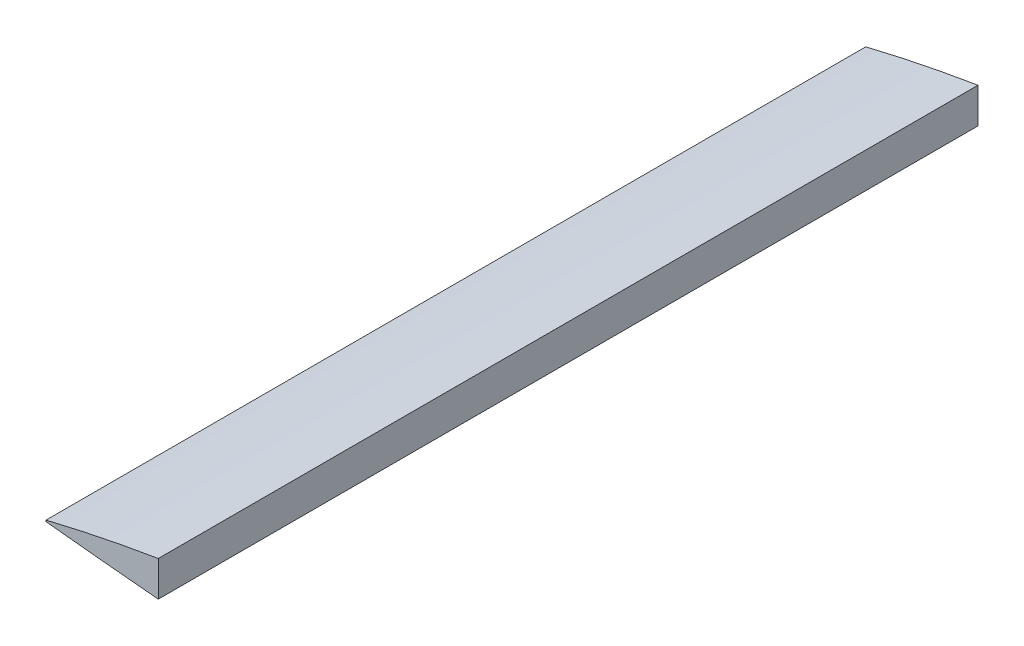
ISO-10303-21;
HEADER;
FILE_DESCRIPTION(('STEP AP214'),'2;1');
FILE_NAME('part.step','',(''),(''),'','','');
FILE_SCHEMA(('AUTOMOTIVE_DESIGN { 1 0 10303 214 1 1 1 1 }'));
ENDSEC;
DATA;
#1=APPLICATION_CONTEXT('core data for automotive mechanical design processes');
#2=APPLICATION_PROTOCOL_DEFINITION('international standard','automotive_design',2000,#1);
#3=PRODUCT_CONTEXT('',#1,'mechanical');
#4=PRODUCT('Part','Part','',(#3));
#5=PRODUCT_RELATED_PRODUCT_CATEGORY('part','',(#4));
#6=PRODUCT_DEFINITION_FORMATION('','',#4);
#7=PRODUCT_DEFINITION_CONTEXT('part definition',#1,'design');
#8=PRODUCT_DEFINITION('design','',#6,#7);
#9=PRODUCT_DEFINITION_SHAPE('','',#8);
#10=(LENGTH_UNIT() NAMED_UNIT(*) SI_UNIT(.MILLI.,.METRE.));
#11=(NAMED_UNIT(*) PLANE_ANGLE_UNIT() SI_UNIT($,.RADIAN.));
#12=(NAMED_UNIT(*) SI_UNIT($,.STERADIAN.) SOLID_ANGLE_UNIT());
#13=UNCERTAINTY_MEASURE_WITH_UNIT(LENGTH_MEASURE(1.E-05),#10,'distance_accuracy_value','');
#14=(GEOMETRIC_REPRESENTATION_CONTEXT(3) GLOBAL_UNCERTAINTY_ASSIGNED_CONTEXT((#13)) GLOBAL_UNIT_ASSIGNED_CONTEXT((#10,
#11,#12)) REPRESENTATION_CONTEXT('',''));
#15=CARTESIAN_POINT('',(0.,0.,0.));
#16=DIRECTION('',(0.,0.,1.));
#17=DIRECTION('',(1.,0.,0.));
#18=AXIS2_PLACEMENT_3D('',#15,#16,#17);
#19=CARTESIAN_POINT('',(-238.52642,17.5878370076643,612.));
#20=CARTESIAN_POINT('',(-240.974092949972,17.1818838754023,612.));
#21=CARTESIAN_POINT('',(-246.929768523728,16.1941190868382,612.));
#22=CARTESIAN_POINT('',(-256.181161895511,14.5460715684089,612.));
#23=CARTESIAN_POINT('',(-266.070660074322,12.7092596735176,612.));
#24=CARTESIAN_POINT('',(-275.306483122763,10.9116484889903,612.));
#25=CARTESIAN_POINT('',(-283.834265101251,9.183942036888,612.));
#26=CARTESIAN_POINT('',(-291.603292922688,7.5511249847941,612.));
#27=CARTESIAN_POINT('',(-298.567864300226,6.03877561329265,612.));
#28=CARTESIAN_POINT('',(-304.687234381282,4.67105765373805,612.));
#29=CARTESIAN_POINT('',(-309.925850126722,3.47060146510907,612.));
#30=CARTESIAN_POINT('',(-314.253461717538,2.45784481186031,612.));
#31=CARTESIAN_POINT('',(-317.645235976134,1.65054432161122,612.));
#32=CARTESIAN_POINT('',(-320.081782459232,1.06307048748221,612.));
#33=CARTESIAN_POINT('',(-321.538022535749,0.70902490136111,612.));
#34=CARTESIAN_POINT('',(-322.180548985879,0.552044035812624,612.));
#35=CARTESIAN_POINT('',(-322.333,0.514797487992484,612.));
#36=B_SPLINE_CURVE_WITH_KNOTS('',3,(#19,#20,#21,#22,#23,#24,#25,#26,#27,#28,#29,#30,#31,#32,#33,
#34,#35),.UNSPECIFIED.,.F.,.F.,(4,1,1,1,1,1,1,1,1,1,1,1,1,1,4),(0.,0.0870070051452904,
0.21170536500617,0.329527112719374,0.439740644540536,0.541660709078569,0.634652346186561,
0.718134668905484,0.791584505134145,0.854539888493236,0.906603358473801,0.947445002011979,
0.976805146454737,0.994496601743555,1.),.UNSPECIFIED.);
#37=DIRECTION('',(0.,0.,-1.));
#38=VECTOR('',#37,1.);
#39=SURFACE_OF_LINEAR_EXTRUSION('',#36,#38);
#40=CARTESIAN_POINT('',(-238.52642,17.5878370076643,0.));
#41=CARTESIAN_POINT('',(-240.974092949972,17.1818838754023,0.));
#42=CARTESIAN_POINT('',(-246.929768523728,16.1941190868382,0.));
#43=CARTESIAN_POINT('',(-256.181161895511,14.5460715684089,0.));
#44=CARTESIAN_POINT('',(-266.070660074322,12.7092596735176,0.));
#45=CARTESIAN_POINT('',(-275.306483122763,10.9116484889903,0.));
#46=CARTESIAN_POINT('',(-283.834265101251,9.183942036888,0.));
#47=CARTESIAN_POINT('',(-291.603292922688,7.5511249847941,0.));
#48=CARTESIAN_POINT('',(-298.567864300226,6.03877561329265,0.));
#49=CARTESIAN_POINT('',(-304.687234381282,4.67105765373805,0.));
#50=CARTESIAN_POINT('',(-309.925850126722,3.47060146510907,0.));
#51=CARTESIAN_POINT('',(-314.253461717538,2.45784481186031,0.));
#52=CARTESIAN_POINT('',(-317.645235976134,1.65054432161122,0.));
#53=CARTESIAN_POINT('',(-320.081782459232,1.06307048748221,0.));
#54=CARTESIAN_POINT('',(-321.538022535749,0.70902490136111,0.));
#55=CARTESIAN_POINT('',(-322.180548985879,0.552044035812624,0.));
#56=CARTESIAN_POINT('',(-322.333,0.514797487992484,0.));
#57=B_SPLINE_CURVE_WITH_KNOTS('',3,(#40,#41,#42,#43,#44,#45,#46,#47,#48,#49,#50,#51,#52,#53,#54,
#55,#56),.UNSPECIFIED.,.F.,.F.,(4,1,1,1,1,1,1,1,1,1,1,1,1,1,4),(0.,0.0870070051452904,
0.21170536500617,0.329527112719374,0.439740644540536,0.541660709078569,0.634652346186561,
0.718134668905484,0.791584505134145,0.854539888493236,0.906603358473801,0.947445002011979,
0.976805146454737,0.994496601743555,1.),.UNSPECIFIED.);
#58=CARTESIAN_POINT('',(-238.52642,17.5878370076643,0.));
#59=VERTEX_POINT('',#58);
#60=CARTESIAN_POINT('',(-322.333,0.514797487992484,0.));
#61=VERTEX_POINT('',#60);
#62=EDGE_CURVE('E134',#59,#61,#57,.T.);
#63=ORIENTED_EDGE('',*,*,#62,.T.);
#64=DIRECTION('',(0.,0.,-1.));
#65=VECTOR('',#64,1.);
#66=CARTESIAN_POINT('',(-322.333,0.514797487992484,612.));
#67=LINE('',#66,#65);
#68=CARTESIAN_POINT('',(-322.333,0.514797487992484,612.));
#69=VERTEX_POINT('',#68);
#70=EDGE_CURVE('E184',#69,#61,#67,.T.);
#71=ORIENTED_EDGE('',*,*,#70,.F.);
#72=CARTESIAN_POINT('',(-238.52642,17.5878370076643,612.));
#73=VERTEX_POINT('',#72);
#74=EDGE_CURVE('E147',#73,#69,#36,.T.);
#75=ORIENTED_EDGE('',*,*,#74,.F.);
#76=DIRECTION('',(0.,0.,-1.));
#77=VECTOR('',#76,1.);
#78=CARTESIAN_POINT('',(-238.52642,17.5878370076643,612.));
#79=LINE('',#78,#77);
#80=EDGE_CURVE('E204',#73,#59,#79,.T.);
#81=ORIENTED_EDGE('',*,*,#80,.T.);
#82=EDGE_LOOP('',(#63,#71,#75,#81));
#83=FACE_BOUND('',#82,.T.);
#84=ADVANCED_FACE('F39',(#83),#39,.F.);
#85=CARTESIAN_POINT('',(-322.333,0.514797487992484,612.));
#86=DIRECTION('',(1.,0.,0.));
#87=DIRECTION('',(0.,0.,-1.));
#88=AXIS2_PLACEMENT_3D('',#85,#86,#87);
#89=PLANE('',#88);
#90=DIRECTION('',(0.,-1.,0.));
#91=VECTOR('',#90,1.);
#92=CARTESIAN_POINT('',(-322.333,0.514797487992484,0.));
#93=LINE('',#92,#91);
#94=CARTESIAN_POINT('',(-322.333,-0.506550056177637,0.));
#95=VERTEX_POINT('',#94);
#96=EDGE_CURVE('E179',#61,#95,#93,.T.);
#97=ORIENTED_EDGE('',*,*,#96,.T.);
#98=DIRECTION('',(0.,0.,-1.));
#99=VECTOR('',#98,1.);
#100=CARTESIAN_POINT('',(-322.333,-0.506550056177637,612.));
#101=LINE('',#100,#99);
#102=CARTESIAN_POINT('',(-322.333,-0.506550056177637,612.));
#103=VERTEX_POINT('',#102);
#104=EDGE_CURVE('E181',#103,#95,#101,.T.);
#105=ORIENTED_EDGE('',*,*,#104,.F.);
#106=DIRECTION('',(0.,-1.,0.));
#107=VECTOR('',#106,1.);
#108=CARTESIAN_POINT('',(-322.333,0.514797487992484,612.));
#109=LINE('',#108,#107);
#110=EDGE_CURVE('E94',#69,#103,#109,.T.);
#111=ORIENTED_EDGE('',*,*,#110,.F.);
#112=ORIENTED_EDGE('',*,*,#70,.T.);
#113=EDGE_LOOP('',(#97,#105,#111,#112));
#114=FACE_BOUND('',#113,.T.);
#115=ADVANCED_FACE('F170',(#114),#89,.F.);
#116=CARTESIAN_POINT('',(-322.333,-0.506550056177637,612.));
#117=CARTESIAN_POINT('',(-322.321741192867,-0.506509981551179,612.));
#118=CARTESIAN_POINT('',(-322.141989510192,-0.505870172959284,612.));
#119=CARTESIAN_POINT('',(-321.464120443008,-0.620061141040111,612.));
#120=CARTESIAN_POINT('',(-319.961203892299,-0.741044399369998,612.));
#121=CARTESIAN_POINT('',(-317.472079994317,-1.02767765853985,612.));
#122=CARTESIAN_POINT('',(-314.008232693801,-1.38276070488723,612.));
#123=CARTESIAN_POINT('',(-309.594932863968,-1.84681463713867,612.));
#124=CARTESIAN_POINT('',(-304.260184655827,-2.39533472644298,612.));
#125=CARTESIAN_POINT('',(-298.039247242634,-3.02859766428665,612.));
#126=CARTESIAN_POINT('',(-290.972478701488,-3.73716679662763,612.));
#127=CARTESIAN_POINT('',(-283.105667880865,-4.514534116657,612.));
#128=CARTESIAN_POINT('',(-274.489440351608,-5.35291829584387,612.));
#129=CARTESIAN_POINT('',(-265.178981161559,-6.24499515598002,612.));
#130=CARTESIAN_POINT('',(-255.233473927844,-7.18185891999825,612.));
#131=CARTESIAN_POINT('',(-246.278870053507,-8.01388768890295,612.));
#132=CARTESIAN_POINT('',(-240.645712688873,-8.52456633628809,612.));
#133=CARTESIAN_POINT('',(-238.52642,-8.71669260823671,612.));
#134=B_SPLINE_CURVE_WITH_KNOTS('',3,(#116,#117,#118,#119,#120,#121,#122,#123,#124,#125,#126,
#127,#128,#129,#130,#131,#132,#133),.UNSPECIFIED.,.F.,.F.,(4,1,1,1,1,1,1,1,1,1,1,1,1,1,1,4),(0.,
0.000401027004237386,0.00640256804801387,0.024366740541906,0.0541726551316404,
0.0956203448841404,0.148432949269866,0.212259606924723,0.286678920603446,0.371202853061501,
0.465280924763119,0.568304609739685,0.67961185947699,0.798491720853711,0.924189047970984,1.),.UNSPECIFIED.);
#135=DIRECTION('',(0.,0.,-1.));
#136=VECTOR('',#135,1.);
#137=SURFACE_OF_LINEAR_EXTRUSION('',#134,#136);
#138=DIRECTION('',(0.,0.,-1.));
#139=VECTOR('',#138,1.);
#140=CARTESIAN_POINT('',(-262.25,-6.51994947051922,612.));
#141=LINE('',#140,#139);
#142=CARTESIAN_POINT('',(-262.25,-6.51994947132136,96.8999999999999));
#143=VERTEX_POINT('',#142);
#144=CARTESIAN_POINT('',(-262.249999991514,-6.51994947132136,83.8999999999999));
#145=VERTEX_POINT('',#144);
#146=EDGE_CURVE('E49',#143,#145,#141,.T.);
#147=ORIENTED_EDGE('',*,*,#146,.F.);
#148=CARTESIAN_POINT('',(-322.333,-0.506550056177637,96.9));
#149=CARTESIAN_POINT('',(-322.321741192867,-0.506509981551179,96.9));
#150=CARTESIAN_POINT('',(-322.141989510192,-0.505870172959284,96.9));
#151=CARTESIAN_POINT('',(-321.464120443008,-0.620061141040111,96.9));
#152=CARTESIAN_POINT('',(-319.961203892299,-0.741044399369998,96.9));
#153=CARTESIAN_POINT('',(-317.472079994317,-1.02767765853985,96.9));
#154=CARTESIAN_POINT('',(-314.008232693801,-1.38276070488723,96.9));
#155=CARTESIAN_POINT('',(-309.594932863968,-1.84681463713867,96.9));
#156=CARTESIAN_POINT('',(-304.260184655827,-2.39533472644298,96.9));
#157=CARTESIAN_POINT('',(-298.039247242634,-3.02859766428665,96.9));
#158=CARTESIAN_POINT('',(-290.972478701488,-3.73716679662763,96.9));
#159=CARTESIAN_POINT('',(-283.105667880865,-4.514534116657,96.9));
#160=CARTESIAN_POINT('',(-274.489440351608,-5.35291829584387,96.9));
#161=CARTESIAN_POINT('',(-265.178981161559,-6.24499515598002,96.9));
#162=CARTESIAN_POINT('',(-255.233473927844,-7.18185891999825,96.9));
#163=CARTESIAN_POINT('',(-246.278870053507,-8.01388768890295,96.9));
#164=CARTESIAN_POINT('',(-240.645712688873,-8.52456633628809,96.9));
#165=CARTESIAN_POINT('',(-238.52642,-8.71669260823671,96.9));
#166=B_SPLINE_CURVE_WITH_KNOTS('',3,(#148,#149,#150,#151,#152,#153,#154,#155,#156,#157,#158,
#159,#160,#161,#162,#163,#164,#165),.UNSPECIFIED.,.F.,.F.,(4,1,1,1,1,1,1,1,1,1,1,1,1,1,1,4),(0.,
0.000401027004237386,0.00640256804801387,0.024366740541906,0.0541726551316404,
0.0956203448841404,0.148432949269866,0.212259606924723,0.286678920603446,0.371202853061501,
0.465280924763119,0.568304609739685,0.67961185947699,0.798491720853711,0.924189047970984,1.),.UNSPECIFIED.);
#167=CARTESIAN_POINT('',(-241.25,-8.46964250475909,96.8999999999999));
#168=VERTEX_POINT('',#167);
#169=EDGE_CURVE('E11',#143,#168,#166,.T.);
#170=ORIENTED_EDGE('',*,*,#169,.T.);
#171=DIRECTION('',(0.,0.,-1.));
#172=VECTOR('',#171,1.);
#173=CARTESIAN_POINT('',(-241.25,-8.46964250475909,612.));
#174=LINE('',#173,#172);
#175=CARTESIAN_POINT('',(-241.25,-8.46964250475909,83.8999999999999));
#176=VERTEX_POINT('',#175);
#177=EDGE_CURVE('E123',#176,#168,#174,.F.);
#178=ORIENTED_EDGE('',*,*,#177,.F.);
#179=CARTESIAN_POINT('',(-322.333,-0.506550056177637,83.8999999999999));
#180=CARTESIAN_POINT('',(-322.321741192867,-0.506509981551179,83.8999999999999));
#181=CARTESIAN_POINT('',(-322.141989510192,-0.505870172959284,83.8999999999999));
#182=CARTESIAN_POINT('',(-321.464120443008,-0.620061141040111,83.8999999999999));
#183=CARTESIAN_POINT('',(-319.961203892299,-0.741044399369998,83.8999999999999));
#184=CARTESIAN_POINT('',(-317.472079994317,-1.02767765853985,83.8999999999999));
#185=CARTESIAN_POINT('',(-314.008232693801,-1.38276070488723,83.8999999999999));
#186=CARTESIAN_POINT('',(-309.594932863968,-1.84681463713867,83.8999999999999));
#187=CARTESIAN_POINT('',(-304.260184655827,-2.39533472644298,83.8999999999999));
#188=CARTESIAN_POINT('',(-298.039247242634,-3.02859766428665,83.8999999999999));
#189=CARTESIAN_POINT('',(-290.972478701488,-3.73716679662763,83.8999999999999));
#190=CARTESIAN_POINT('',(-283.105667880865,-4.514534116657,83.8999999999999));
#191=CARTESIAN_POINT('',(-274.489440351608,-5.35291829584387,83.8999999999999));
#192=CARTESIAN_POINT('',(-265.178981161559,-6.24499515598002,83.8999999999999));
#193=CARTESIAN_POINT('',(-255.233473927844,-7.18185891999825,83.8999999999999));
#194=CARTESIAN_POINT('',(-246.278870053507,-8.01388768890295,83.8999999999999));
#195=CARTESIAN_POINT('',(-240.645712688873,-8.52456633628809,83.8999999999999));
#196=CARTESIAN_POINT('',(-238.52642,-8.71669260823671,83.8999999999999));
#197=B_SPLINE_CURVE_WITH_KNOTS('',3,(#179,#180,#181,#182,#183,#184,#185,#186,#187,#188,#189,
#190,#191,#192,#193,#194,#195,#196),.UNSPECIFIED.,.F.,.F.,(4,1,1,1,1,1,1,1,1,1,1,1,1,1,1,4),(0.,
0.000401027004237386,0.00640256804801387,0.024366740541906,0.0541726551316404,
0.0956203448841404,0.148432949269866,0.212259606924723,0.286678920603446,0.371202853061501,
0.465280924763119,0.568304609739685,0.67961185947699,0.798491720853711,0.924189047970984,1.),.UNSPECIFIED.);
#198=EDGE_CURVE('E208',#145,#176,#197,.T.);
#199=ORIENTED_EDGE('',*,*,#198,.F.);
#200=EDGE_LOOP('',(#147,#170,#178,#199));
#201=FACE_BOUND('',#200,.T.);
#202=CARTESIAN_POINT('',(-322.333,-0.506550056177637,0.));
#203=CARTESIAN_POINT('',(-322.321741192867,-0.506509981551179,0.));
#204=CARTESIAN_POINT('',(-322.141989510192,-0.505870172959284,0.));
#205=CARTESIAN_POINT('',(-321.464120443008,-0.620061141040111,0.));
#206=CARTESIAN_POINT('',(-319.961203892299,-0.741044399369998,0.));
#207=CARTESIAN_POINT('',(-317.472079994317,-1.02767765853985,0.));
#208=CARTESIAN_POINT('',(-314.008232693801,-1.38276070488723,0.));
#209=CARTESIAN_POINT('',(-309.594932863968,-1.84681463713867,0.));
#210=CARTESIAN_POINT('',(-304.260184655827,-2.39533472644298,0.));
#211=CARTESIAN_POINT('',(-298.039247242634,-3.02859766428665,0.));
#212=CARTESIAN_POINT('',(-290.972478701488,-3.73716679662763,0.));
#213=CARTESIAN_POINT('',(-283.105667880865,-4.514534116657,0.));
#214=CARTESIAN_POINT('',(-274.489440351608,-5.35291829584387,0.));
#215=CARTESIAN_POINT('',(-265.178981161559,-6.24499515598002,0.));
#216=CARTESIAN_POINT('',(-255.233473927844,-7.18185891999825,0.));
#217=CARTESIAN_POINT('',(-246.278870053507,-8.01388768890295,0.));
#218=CARTESIAN_POINT('',(-240.645712688873,-8.52456633628809,0.));
#219=CARTESIAN_POINT('',(-238.52642,-8.71669260823671,0.));
#220=B_SPLINE_CURVE_WITH_KNOTS('',3,(#202,#203,#204,#205,#206,#207,#208,#209,#210,#211,#212,
#213,#214,#215,#216,#217,#218,#219),.UNSPECIFIED.,.F.,.F.,(4,1,1,1,1,1,1,1,1,1,1,1,1,1,1,4),(0.,
0.000401027004237386,0.00640256804801387,0.024366740541906,0.0541726551316404,
0.0956203448841404,0.148432949269866,0.212259606924723,0.286678920603446,0.371202853061501,
0.465280924763119,0.568304609739685,0.67961185947699,0.798491720853711,0.924189047970984,1.),.UNSPECIFIED.);
#221=CARTESIAN_POINT('',(-238.52642,-8.71669260823671,0.));
#222=VERTEX_POINT('',#221);
#223=EDGE_CURVE('E189',#95,#222,#220,.T.);
#224=ORIENTED_EDGE('',*,*,#223,.T.);
#225=DIRECTION('',(0.,0.,-1.));
#226=VECTOR('',#225,1.);
#227=CARTESIAN_POINT('',(-238.52642,-8.71669260823671,612.));
#228=LINE('',#227,#226);
#229=CARTESIAN_POINT('',(-238.52642,-8.71669260823671,612.));
#230=VERTEX_POINT('',#229);
#231=EDGE_CURVE('E193',#230,#222,#228,.T.);
#232=ORIENTED_EDGE('',*,*,#231,.F.);
#233=EDGE_CURVE('E156',#103,#230,#134,.T.);
#234=ORIENTED_EDGE('',*,*,#233,.F.);
#235=ORIENTED_EDGE('',*,*,#104,.T.);
#236=EDGE_LOOP('',(#224,#232,#234,#235));
#237=FACE_BOUND('',#236,.T.);
#238=ADVANCED_FACE('F166',(#201,#237),#137,.F.);
#239=CARTESIAN_POINT('',(-238.52642,17.5878370076643,612.));
#240=DIRECTION('',(-1.,0.,0.));
#241=DIRECTION('',(0.,0.,1.));
#242=AXIS2_PLACEMENT_3D('',#239,#240,#241);
#243=PLANE('',#242);
#244=DIRECTION('',(0.,1.,0.));
#245=VECTOR('',#244,1.);
#246=CARTESIAN_POINT('',(-238.52642,17.5878370076643,0.));
#247=LINE('',#246,#245);
#248=EDGE_CURVE('E86',#222,#59,#247,.T.);
#249=ORIENTED_EDGE('',*,*,#248,.T.);
#250=ORIENTED_EDGE('',*,*,#80,.F.);
#251=DIRECTION('',(0.,1.,0.));
#252=VECTOR('',#251,1.);
#253=CARTESIAN_POINT('',(-238.52642,17.5878370076643,612.));
#254=LINE('',#253,#252);
#255=EDGE_CURVE('E65',#230,#73,#254,.T.);
#256=ORIENTED_EDGE('',*,*,#255,.F.);
#257=ORIENTED_EDGE('',*,*,#231,.T.);
#258=EDGE_LOOP('',(#249,#250,#256,#257));
#259=FACE_BOUND('',#258,.T.);
#260=ADVANCED_FACE('F169',(#259),#243,.F.);
#261=CARTESIAN_POINT('',(-280.590138371107,9.83812054521177,612.));
#262=DIRECTION('',(0.,0.,-1.));
#263=DIRECTION('',(-1.,0.,0.));
#264=AXIS2_PLACEMENT_3D('',#261,#262,#263);
#265=PLANE('',#264);
#266=ORIENTED_EDGE('',*,*,#74,.T.);
#267=ORIENTED_EDGE('',*,*,#110,.T.);
#268=ORIENTED_EDGE('',*,*,#233,.T.);
#269=ORIENTED_EDGE('',*,*,#255,.T.);
#270=EDGE_LOOP('',(#266,#267,#268,#269));
#271=FACE_BOUND('',#270,.T.);
#272=ADVANCED_FACE('F233',(#271),#265,.F.);
#273=CARTESIAN_POINT('',(-280.590138371107,9.83812054521177,0.));
#274=DIRECTION('',(0.,0.,-1.));
#275=DIRECTION('',(-1.,0.,0.));
#276=AXIS2_PLACEMENT_3D('',#273,#274,#275);
#277=PLANE('',#276);
#278=ORIENTED_EDGE('',*,*,#62,.F.);
#279=ORIENTED_EDGE('',*,*,#248,.F.);
#280=ORIENTED_EDGE('',*,*,#223,.F.);
#281=ORIENTED_EDGE('',*,*,#96,.F.);
#282=EDGE_LOOP('',(#278,#279,#280,#281));
#283=FACE_BOUND('',#282,.T.);
#284=ADVANCED_FACE('F195',(#283),#277,.T.);
#285=CARTESIAN_POINT('',(-262.25,2.41,96.8999999999999));
#286=DIRECTION('',(1.,0.,0.));
#287=DIRECTION('',(0.,0.,-1.));
#288=AXIS2_PLACEMENT_3D('',#285,#286,#287);
#289=PLANE('',#288);
#290=ORIENTED_EDGE('',*,*,#146,.T.);
#291=DIRECTION('',(0.,-1.,0.));
#292=VECTOR('',#291,1.);
#293=CARTESIAN_POINT('',(-262.25,2.41,83.8999999999999));
#294=LINE('',#293,#292);
#295=CARTESIAN_POINT('',(-262.25,2.41,83.8999999999999));
#296=VERTEX_POINT('',#295);
#297=EDGE_CURVE('E56',#296,#145,#294,.T.);
#298=ORIENTED_EDGE('',*,*,#297,.F.);
#299=DIRECTION('',(0.,0.,-1.));
#300=VECTOR('',#299,1.);
#301=CARTESIAN_POINT('',(-262.25,2.41,96.8999999999999));
#302=LINE('',#301,#300);
#303=CARTESIAN_POINT('',(-262.25,2.41,96.8999999999999));
#304=VERTEX_POINT('',#303);
#305=EDGE_CURVE('E135',#304,#296,#302,.T.);
#306=ORIENTED_EDGE('',*,*,#305,.F.);
#307=DIRECTION('',(0.,-1.,0.));
#308=VECTOR('',#307,1.);
#309=CARTESIAN_POINT('',(-262.25,2.41,96.8999999999999));
#310=LINE('',#309,#308);
#311=EDGE_CURVE('E127',#304,#143,#310,.T.);
#312=ORIENTED_EDGE('',*,*,#311,.T.);
#313=EDGE_LOOP('',(#290,#298,#306,#312));
#314=FACE_BOUND('',#313,.T.);
#315=ADVANCED_FACE('F218',(#314),#289,.T.);
#316=CARTESIAN_POINT('',(-241.25,-9.09,96.8999999999999));
#317=DIRECTION('',(-1.,0.,0.));
#318=DIRECTION('',(0.,0.,1.));
#319=AXIS2_PLACEMENT_3D('',#316,#317,#318);
#320=PLANE('',#319);
#321=ORIENTED_EDGE('',*,*,#177,.T.);
#322=DIRECTION('',(0.,1.,0.));
#323=VECTOR('',#322,1.);
#324=CARTESIAN_POINT('',(-241.25,-9.09,96.8999999999999));
#325=LINE('',#324,#323);
#326=CARTESIAN_POINT('',(-241.25,2.41,96.8999999999999));
#327=VERTEX_POINT('',#326);
#328=EDGE_CURVE('E116',#168,#327,#325,.T.);
#329=ORIENTED_EDGE('',*,*,#328,.T.);
#330=DIRECTION('',(0.,0.,-1.));
#331=VECTOR('',#330,1.);
#332=CARTESIAN_POINT('',(-241.25,2.41,96.8999999999999));
#333=LINE('',#332,#331);
#334=CARTESIAN_POINT('',(-241.25,2.41,83.8999999999999));
#335=VERTEX_POINT('',#334);
#336=EDGE_CURVE('E120',#327,#335,#333,.T.);
#337=ORIENTED_EDGE('',*,*,#336,.T.);
#338=DIRECTION('',(0.,1.,0.));
#339=VECTOR('',#338,1.);
#340=CARTESIAN_POINT('',(-241.25,-9.09,83.8999999999999));
#341=LINE('',#340,#339);
#342=EDGE_CURVE('E145',#176,#335,#341,.T.);
#343=ORIENTED_EDGE('',*,*,#342,.F.);
#344=EDGE_LOOP('',(#321,#329,#337,#343));
#345=FACE_BOUND('',#344,.T.);
#346=ADVANCED_FACE('F118',(#345),#320,.T.);
#347=CARTESIAN_POINT('',(0.,0.,96.8999999999999));
#348=DIRECTION('',(0.,0.,1.));
#349=DIRECTION('',(1.,0.,0.));
#350=AXIS2_PLACEMENT_3D('',#347,#348,#349);
#351=PLANE('',#350);
#352=ORIENTED_EDGE('',*,*,#311,.F.);
#353=DIRECTION('',(-1.,0.,0.));
#354=VECTOR('',#353,1.);
#355=CARTESIAN_POINT('',(-241.25,2.41,96.8999999999999));
#356=LINE('',#355,#354);
#357=EDGE_CURVE('E126',#327,#304,#356,.T.);
#358=ORIENTED_EDGE('',*,*,#357,.F.);
#359=ORIENTED_EDGE('',*,*,#328,.F.);
#360=ORIENTED_EDGE('',*,*,#169,.F.);
#361=EDGE_LOOP('',(#352,#358,#359,#360));
#362=FACE_BOUND('',#361,.T.);
#363=ADVANCED_FACE('F138',(#362),#351,.F.);
#364=CARTESIAN_POINT('',(0.,0.,83.8999999999999));
#365=DIRECTION('',(0.,0.,1.));
#366=DIRECTION('',(1.,0.,0.));
#367=AXIS2_PLACEMENT_3D('',#364,#365,#366);
#368=PLANE('',#367);
#369=ORIENTED_EDGE('',*,*,#198,.T.);
#370=ORIENTED_EDGE('',*,*,#342,.T.);
#371=DIRECTION('',(-1.,0.,0.));
#372=VECTOR('',#371,1.);
#373=CARTESIAN_POINT('',(-241.25,2.41,83.8999999999999));
#374=LINE('',#373,#372);
#375=EDGE_CURVE('E133',#335,#296,#374,.T.);
#376=ORIENTED_EDGE('',*,*,#375,.T.);
#377=ORIENTED_EDGE('',*,*,#297,.T.);
#378=EDGE_LOOP('',(#369,#370,#376,#377));
#379=FACE_BOUND('',#378,.T.);
#380=ADVANCED_FACE('F219',(#379),#368,.T.);
#381=CARTESIAN_POINT('',(-241.25,2.41,96.8999999999999));
#382=DIRECTION('',(0.,-1.,0.));
#383=DIRECTION('',(0.,0.,-1.));
#384=AXIS2_PLACEMENT_3D('',#381,#382,#383);
#385=PLANE('',#384);
#386=ORIENTED_EDGE('',*,*,#375,.F.);
#387=ORIENTED_EDGE('',*,*,#336,.F.);
#388=ORIENTED_EDGE('',*,*,#357,.T.);
#389=ORIENTED_EDGE('',*,*,#305,.T.);
#390=EDGE_LOOP('',(#386,#387,#388,#389));
#391=FACE_BOUND('',#390,.T.);
#392=ADVANCED_FACE('F130',(#391),#385,.T.);
#393=CLOSED_SHELL('',(#84,#115,#238,#260,#272,#284,#315,#346,#363,#380,#392));
#394=MANIFOLD_SOLID_BREP('B2',#393);
#395=ADVANCED_BREP_SHAPE_REPRESENTATION('',(#18,#394),#14);
#396=SHAPE_DEFINITION_REPRESENTATION(#9,#395);
ENDSEC;
END-ISO-10303-21;
